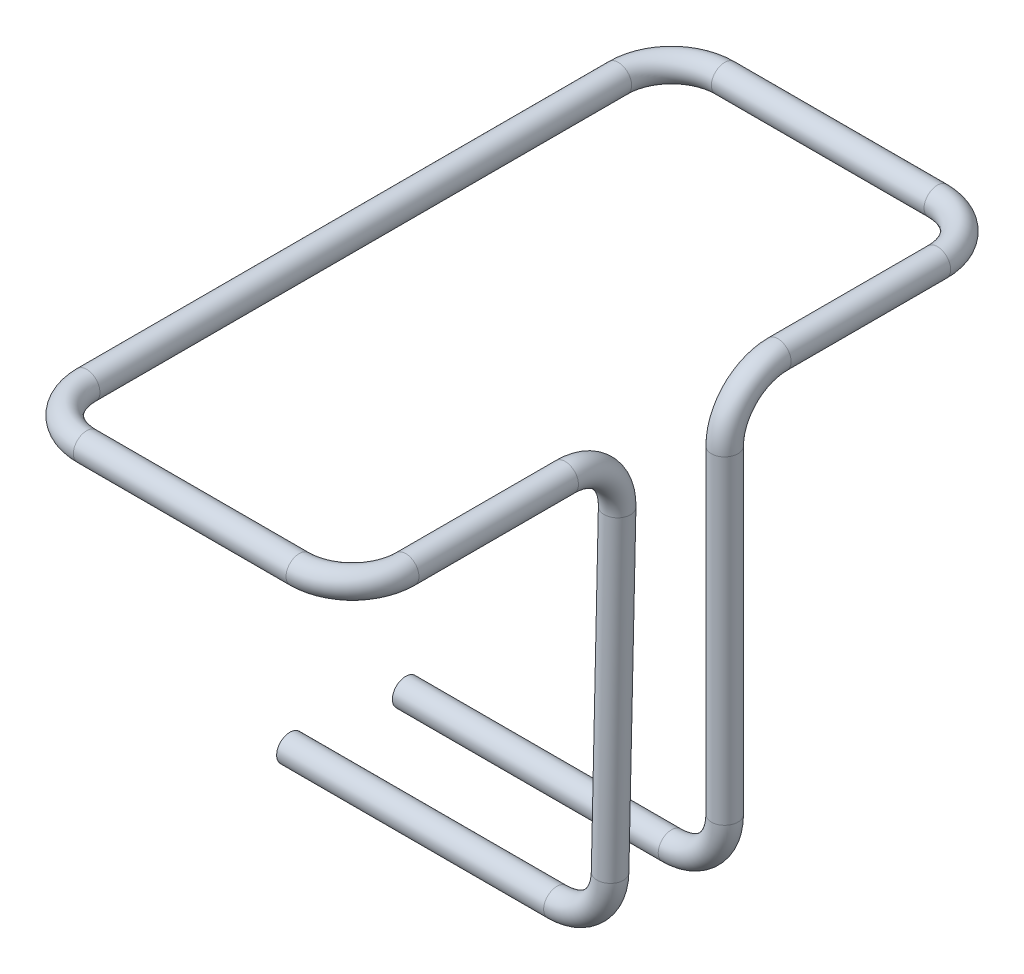
ISO-10303-21;
HEADER;
FILE_DESCRIPTION(('STEP AP214'),'2;1');
FILE_NAME('part.step','',(''),(''),'','','');
FILE_SCHEMA(('AUTOMOTIVE_DESIGN { 1 0 10303 214 1 1 1 1 }'));
ENDSEC;
DATA;
#1=APPLICATION_CONTEXT('core data for automotive mechanical design processes');
#2=APPLICATION_PROTOCOL_DEFINITION('international standard','automotive_design',2000,#1);
#3=PRODUCT_CONTEXT('',#1,'mechanical');
#4=PRODUCT('Part','Part','',(#3));
#5=PRODUCT_RELATED_PRODUCT_CATEGORY('part','',(#4));
#6=PRODUCT_DEFINITION_FORMATION('','',#4);
#7=PRODUCT_DEFINITION_CONTEXT('part definition',#1,'design');
#8=PRODUCT_DEFINITION('design','',#6,#7);
#9=PRODUCT_DEFINITION_SHAPE('','',#8);
#10=(LENGTH_UNIT() NAMED_UNIT(*) SI_UNIT(.MILLI.,.METRE.));
#11=(NAMED_UNIT(*) PLANE_ANGLE_UNIT() SI_UNIT($,.RADIAN.));
#12=(NAMED_UNIT(*) SI_UNIT($,.STERADIAN.) SOLID_ANGLE_UNIT());
#13=UNCERTAINTY_MEASURE_WITH_UNIT(LENGTH_MEASURE(1.E-05),#10,'distance_accuracy_value','');
#14=(GEOMETRIC_REPRESENTATION_CONTEXT(3) GLOBAL_UNCERTAINTY_ASSIGNED_CONTEXT((#13)) GLOBAL_UNIT_ASSIGNED_CONTEXT((#10,
#11,#12)) REPRESENTATION_CONTEXT('',''));
#15=CARTESIAN_POINT('',(0.,0.,0.));
#16=DIRECTION('',(0.,0.,1.));
#17=DIRECTION('',(1.,0.,0.));
#18=AXIS2_PLACEMENT_3D('',#15,#16,#17);
#19=CARTESIAN_POINT('',(0.,0.,0.));
#20=DIRECTION('',(1.,0.,0.));
#21=DIRECTION('',(0.,0.,-1.));
#22=AXIS2_PLACEMENT_3D('',#19,#20,#21);
#23=PLANE('',#22);
#24=CARTESIAN_POINT('',(0.,0.,0.));
#25=DIRECTION('',(1.,0.,0.));
#26=DIRECTION('',(0.,0.,-1.));
#27=AXIS2_PLACEMENT_3D('',#24,#25,#26);
#28=CIRCLE('',#27,0.125);
#29=CARTESIAN_POINT('',(0.,0.,-0.125));
#30=VERTEX_POINT('',#29);
#31=EDGE_CURVE('E89',#30,#30,#28,.T.);
#32=ORIENTED_EDGE('',*,*,#31,.F.);
#33=EDGE_LOOP('',(#32));
#34=FACE_BOUND('',#33,.T.);
#35=ADVANCED_FACE('F31',(#34),#23,.F.);
#36=CARTESIAN_POINT('',(0.0883487566823759,-0.000975806875798228,-1.));
#37=DIRECTION('',(-1.,0.,0.));
#38=DIRECTION('',(0.,-0.0220871891705938,0.999756048281051));
#39=AXIS2_PLACEMENT_3D('',#36,#37,#38);
#40=PLANE('',#39);
#41=CARTESIAN_POINT('',(0.0883487566823759,-0.000975806875798228,-1.));
#42=DIRECTION('',(-1.,0.,0.));
#43=DIRECTION('',(0.,-0.0220871891705938,0.999756048281051));
#44=AXIS2_PLACEMENT_3D('',#41,#42,#43);
#45=CIRCLE('',#44,0.125);
#46=CARTESIAN_POINT('',(0.0883487566823759,-0.00373670552212245,-0.875030493964869));
#47=VERTEX_POINT('',#46);
#48=EDGE_CURVE('E10',#47,#47,#45,.T.);
#49=ORIENTED_EDGE('',*,*,#48,.T.);
#50=EDGE_LOOP('',(#49));
#51=FACE_BOUND('',#50,.T.);
#52=ADVANCED_FACE('F96',(#51),#40,.T.);
#53=CARTESIAN_POINT('',(0.,0.,0.));
#54=DIRECTION('',(1.,0.,0.));
#55=DIRECTION('',(0.,0.,-1.));
#56=AXIS2_PLACEMENT_3D('',#53,#54,#55);
#57=CYLINDRICAL_SURFACE('',#56,0.125);
#58=CARTESIAN_POINT('',(2.51092428372362,0.,0.));
#59=DIRECTION('',(1.,0.,0.));
#60=DIRECTION('',(0.,0.,-1.));
#61=AXIS2_PLACEMENT_3D('',#58,#59,#60);
#62=CIRCLE('',#61,0.125);
#63=CARTESIAN_POINT('',(2.51092428372362,-0.125,0.));
#64=VERTEX_POINT('',#63);
#65=EDGE_CURVE('E86',#64,#64,#62,.T.);
#66=ORIENTED_EDGE('',*,*,#65,.F.);
#67=EDGE_LOOP('',(#66));
#68=FACE_BOUND('',#67,.T.);
#69=ORIENTED_EDGE('',*,*,#31,.T.);
#70=EDGE_LOOP('',(#69));
#71=FACE_BOUND('',#70,.T.);
#72=ADVANCED_FACE('F93',(#68,#71),#57,.T.);
#73=CARTESIAN_POINT('',(2.51092428372361,0.5,0.));
#74=DIRECTION('',(0.,0.,1.));
#75=DIRECTION('',(1.,0.,0.));
#76=AXIS2_PLACEMENT_3D('',#73,#74,#75);
#77=TOROIDAL_SURFACE('',#76,0.5,0.125);
#78=CARTESIAN_POINT('',(3.01080230786414,0.488956405414703,0.));
#79=DIRECTION('',(0.0220871891705935,0.999756048281051,0.));
#80=DIRECTION('',(0.,0.,-1.));
#81=AXIS2_PLACEMENT_3D('',#78,#79,#80);
#82=CIRCLE('',#81,0.125);
#83=CARTESIAN_POINT('',(3.13577181389927,0.486195506768379,0.));
#84=VERTEX_POINT('',#83);
#85=EDGE_CURVE('E83',#84,#84,#82,.T.);
#86=CARTESIAN_POINT('',(2.51092428372361,0.5,0.));
#87=DIRECTION('',(0.,0.,1.));
#88=DIRECTION('',(1.,0.,0.));
#89=AXIS2_PLACEMENT_3D('',#86,#87,#88);
#90=CIRCLE('',#89,0.625);
#91=EDGE_CURVE('',#64,#84,#90,.T.);
#92=ORIENTED_EDGE('',*,*,#65,.T.);
#93=ORIENTED_EDGE('',*,*,#85,.F.);
#94=ORIENTED_EDGE('',*,*,#91,.T.);
#95=ORIENTED_EDGE('',*,*,#91,.F.);
#96=EDGE_LOOP('',(#92,#94,#93,#95));
#97=FACE_BOUND('',#96,.T.);
#98=ADVANCED_FACE('F162',(#97),#77,.T.);
#99=CARTESIAN_POINT('',(3.01080230786414,0.488956405414703,0.));
#100=DIRECTION('',(0.022087189170594,0.999756048281051,0.));
#101=DIRECTION('',(-0.999756048281051,0.022087189170594,0.));
#102=AXIS2_PLACEMENT_3D('',#99,#100,#101);
#103=CYLINDRICAL_SURFACE('',#102,0.125);
#104=CARTESIAN_POINT('',(3.07730516209708,3.49914616898368,0.));
#105=DIRECTION('',(0.022087189170594,0.999756048281051,0.));
#106=DIRECTION('',(0.,0.,-1.));
#107=AXIS2_PLACEMENT_3D('',#104,#105,#106);
#108=CIRCLE('',#107,0.125);
#109=CARTESIAN_POINT('',(3.07730516209708,3.49914616898368,-0.125));
#110=VERTEX_POINT('',#109);
#111=EDGE_CURVE('E80',#110,#110,#108,.T.);
#112=ORIENTED_EDGE('',*,*,#111,.F.);
#113=EDGE_LOOP('',(#112));
#114=FACE_BOUND('',#113,.T.);
#115=ORIENTED_EDGE('',*,*,#85,.T.);
#116=EDGE_LOOP('',(#115));
#117=FACE_BOUND('',#116,.T.);
#118=ADVANCED_FACE('F158',(#114,#117),#103,.T.);
#119=CARTESIAN_POINT('',(3.07730516209708,3.49914616898368,0.5));
#120=DIRECTION('',(0.999756048281051,-0.0220871891705937,0.));
#121=DIRECTION('',(0.0220871891705937,0.999756048281051,0.));
#122=AXIS2_PLACEMENT_3D('',#119,#120,#121);
#123=TOROIDAL_SURFACE('',#122,0.5,0.125);
#124=CARTESIAN_POINT('',(3.08834875668238,3.9990241931242,0.5));
#125=DIRECTION('',(0.,0.,1.));
#126=DIRECTION('',(0.0220871891705937,0.999756048281051,0.));
#127=AXIS2_PLACEMENT_3D('',#124,#125,#126);
#128=CIRCLE('',#127,0.125);
#129=CARTESIAN_POINT('',(3.0911096553287,4.12399369915933,0.5));
#130=VERTEX_POINT('',#129);
#131=EDGE_CURVE('E77',#130,#130,#128,.T.);
#132=CARTESIAN_POINT('',(3.07730516209708,3.49914616898368,0.5));
#133=DIRECTION('',(0.999756048281051,-0.0220871891705937,0.));
#134=DIRECTION('',(0.0220871891705937,0.999756048281051,0.));
#135=AXIS2_PLACEMENT_3D('',#132,#133,#134);
#136=CIRCLE('',#135,0.625);
#137=EDGE_CURVE('',#110,#130,#136,.T.);
#138=ORIENTED_EDGE('',*,*,#111,.T.);
#139=ORIENTED_EDGE('',*,*,#131,.F.);
#140=ORIENTED_EDGE('',*,*,#137,.T.);
#141=ORIENTED_EDGE('',*,*,#137,.F.);
#142=EDGE_LOOP('',(#138,#140,#139,#141));
#143=FACE_BOUND('',#142,.T.);
#144=ADVANCED_FACE('F154',(#143),#123,.T.);
#145=CARTESIAN_POINT('',(3.08834875668238,3.9990241931242,0.5));
#146=DIRECTION('',(0.,0.,1.));
#147=DIRECTION('',(0.,-1.,0.));
#148=AXIS2_PLACEMENT_3D('',#145,#146,#147);
#149=CYLINDRICAL_SURFACE('',#148,0.125);
#150=CARTESIAN_POINT('',(3.08834875668238,3.9990241931242,2.));
#151=DIRECTION('',(0.,0.,1.));
#152=DIRECTION('',(0.0220871891705938,0.999756048281051,0.));
#153=AXIS2_PLACEMENT_3D('',#150,#151,#152);
#154=CIRCLE('',#153,0.125);
#155=CARTESIAN_POINT('',(3.21334875668238,3.9990241931242,2.));
#156=VERTEX_POINT('',#155);
#157=EDGE_CURVE('E74',#156,#156,#154,.T.);
#158=ORIENTED_EDGE('',*,*,#157,.F.);
#159=EDGE_LOOP('',(#158));
#160=FACE_BOUND('',#159,.T.);
#161=ORIENTED_EDGE('',*,*,#131,.T.);
#162=EDGE_LOOP('',(#161));
#163=FACE_BOUND('',#162,.T.);
#164=ADVANCED_FACE('F150',(#160,#163),#149,.T.);
#165=CARTESIAN_POINT('',(2.58834875668238,3.9990241931242,2.));
#166=DIRECTION('',(0.,-1.,0.));
#167=DIRECTION('',(0.,0.,-1.));
#168=AXIS2_PLACEMENT_3D('',#165,#166,#167);
#169=TOROIDAL_SURFACE('',#168,0.5,0.125);
#170=CARTESIAN_POINT('',(2.58834875668238,3.9990241931242,2.5));
#171=DIRECTION('',(-1.,0.,0.));
#172=DIRECTION('',(0.,0.999756048281051,0.0220871891705938));
#173=AXIS2_PLACEMENT_3D('',#170,#171,#172);
#174=CIRCLE('',#173,0.125);
#175=CARTESIAN_POINT('',(2.58834875668238,3.9990241931242,2.625));
#176=VERTEX_POINT('',#175);
#177=EDGE_CURVE('E71',#176,#176,#174,.T.);
#178=CARTESIAN_POINT('',(2.58834875668238,3.9990241931242,2.));
#179=DIRECTION('',(0.,-1.,0.));
#180=DIRECTION('',(0.,0.,-1.));
#181=AXIS2_PLACEMENT_3D('',#178,#179,#180);
#182=CIRCLE('',#181,0.625);
#183=EDGE_CURVE('',#156,#176,#182,.T.);
#184=ORIENTED_EDGE('',*,*,#157,.T.);
#185=ORIENTED_EDGE('',*,*,#177,.F.);
#186=ORIENTED_EDGE('',*,*,#183,.T.);
#187=ORIENTED_EDGE('',*,*,#183,.F.);
#188=EDGE_LOOP('',(#184,#186,#185,#187));
#189=FACE_BOUND('',#188,.T.);
#190=ADVANCED_FACE('F146',(#189),#169,.T.);
#191=CARTESIAN_POINT('',(2.58834875668238,3.9990241931242,2.5));
#192=DIRECTION('',(-1.,0.,0.));
#193=DIRECTION('',(0.,0.,1.));
#194=AXIS2_PLACEMENT_3D('',#191,#192,#193);
#195=CYLINDRICAL_SURFACE('',#194,0.125);
#196=CARTESIAN_POINT('',(0.588348756682376,3.9990241931242,2.5));
#197=DIRECTION('',(-1.,0.,0.));
#198=DIRECTION('',(0.,0.999756048281051,0.0220871891705938));
#199=AXIS2_PLACEMENT_3D('',#196,#197,#198);
#200=CIRCLE('',#199,0.125);
#201=CARTESIAN_POINT('',(0.588348756682376,3.9990241931242,2.625));
#202=VERTEX_POINT('',#201);
#203=EDGE_CURVE('E68',#202,#202,#200,.T.);
#204=ORIENTED_EDGE('',*,*,#203,.F.);
#205=EDGE_LOOP('',(#204));
#206=FACE_BOUND('',#205,.T.);
#207=ORIENTED_EDGE('',*,*,#177,.T.);
#208=EDGE_LOOP('',(#207));
#209=FACE_BOUND('',#208,.T.);
#210=ADVANCED_FACE('F142',(#206,#209),#195,.T.);
#211=CARTESIAN_POINT('',(0.588348756682376,3.9990241931242,2.));
#212=DIRECTION('',(0.,-1.,0.));
#213=DIRECTION('',(0.,0.,-1.));
#214=AXIS2_PLACEMENT_3D('',#211,#212,#213);
#215=TOROIDAL_SURFACE('',#214,0.5,0.125);
#216=CARTESIAN_POINT('',(0.0883487566823759,3.9990241931242,2.));
#217=DIRECTION('',(0.,0.,-1.));
#218=DIRECTION('',(-0.0220871891705938,0.999756048281051,0.));
#219=AXIS2_PLACEMENT_3D('',#216,#217,#218);
#220=CIRCLE('',#219,0.125);
#221=CARTESIAN_POINT('',(-0.0366512433176241,3.9990241931242,2.));
#222=VERTEX_POINT('',#221);
#223=EDGE_CURVE('E65',#222,#222,#220,.T.);
#224=CARTESIAN_POINT('',(0.588348756682376,3.9990241931242,2.));
#225=DIRECTION('',(0.,-1.,0.));
#226=DIRECTION('',(0.,0.,-1.));
#227=AXIS2_PLACEMENT_3D('',#224,#225,#226);
#228=CIRCLE('',#227,0.625);
#229=EDGE_CURVE('',#202,#222,#228,.T.);
#230=ORIENTED_EDGE('',*,*,#203,.T.);
#231=ORIENTED_EDGE('',*,*,#223,.F.);
#232=ORIENTED_EDGE('',*,*,#229,.T.);
#233=ORIENTED_EDGE('',*,*,#229,.F.);
#234=EDGE_LOOP('',(#230,#232,#231,#233));
#235=FACE_BOUND('',#234,.T.);
#236=ADVANCED_FACE('F138',(#235),#215,.T.);
#237=CARTESIAN_POINT('',(0.0883487566823759,3.9990241931242,2.));
#238=DIRECTION('',(0.,0.,-1.));
#239=DIRECTION('',(-1.,0.,0.));
#240=AXIS2_PLACEMENT_3D('',#237,#238,#239);
#241=CYLINDRICAL_SURFACE('',#240,0.125);
#242=CARTESIAN_POINT('',(0.0883487566823759,3.9990241931242,-3.));
#243=DIRECTION('',(0.,0.,-1.));
#244=DIRECTION('',(-0.0220871891705938,0.999756048281051,0.));
#245=AXIS2_PLACEMENT_3D('',#242,#243,#244);
#246=CIRCLE('',#245,0.125);
#247=CARTESIAN_POINT('',(-0.0366512433176241,3.9990241931242,-3.));
#248=VERTEX_POINT('',#247);
#249=EDGE_CURVE('E62',#248,#248,#246,.T.);
#250=ORIENTED_EDGE('',*,*,#249,.F.);
#251=EDGE_LOOP('',(#250));
#252=FACE_BOUND('',#251,.T.);
#253=ORIENTED_EDGE('',*,*,#223,.T.);
#254=EDGE_LOOP('',(#253));
#255=FACE_BOUND('',#254,.T.);
#256=ADVANCED_FACE('F134',(#252,#255),#241,.T.);
#257=CARTESIAN_POINT('',(0.588348756682376,3.9990241931242,-3.));
#258=DIRECTION('',(0.,-1.,0.));
#259=DIRECTION('',(0.,0.,-1.));
#260=AXIS2_PLACEMENT_3D('',#257,#258,#259);
#261=TOROIDAL_SURFACE('',#260,0.5,0.125);
#262=CARTESIAN_POINT('',(0.588348756682376,3.9990241931242,-3.5));
#263=DIRECTION('',(1.,0.,0.));
#264=DIRECTION('',(0.,0.999756048281051,-0.0220871891705938));
#265=AXIS2_PLACEMENT_3D('',#262,#263,#264);
#266=CIRCLE('',#265,0.125);
#267=CARTESIAN_POINT('',(0.588348756682376,3.9990241931242,-3.625));
#268=VERTEX_POINT('',#267);
#269=EDGE_CURVE('E59',#268,#268,#266,.T.);
#270=CARTESIAN_POINT('',(0.588348756682376,3.9990241931242,-3.));
#271=DIRECTION('',(0.,-1.,0.));
#272=DIRECTION('',(0.,0.,-1.));
#273=AXIS2_PLACEMENT_3D('',#270,#271,#272);
#274=CIRCLE('',#273,0.625);
#275=EDGE_CURVE('',#248,#268,#274,.T.);
#276=ORIENTED_EDGE('',*,*,#249,.T.);
#277=ORIENTED_EDGE('',*,*,#269,.F.);
#278=ORIENTED_EDGE('',*,*,#275,.T.);
#279=ORIENTED_EDGE('',*,*,#275,.F.);
#280=EDGE_LOOP('',(#276,#278,#277,#279));
#281=FACE_BOUND('',#280,.T.);
#282=ADVANCED_FACE('F130',(#281),#261,.T.);
#283=CARTESIAN_POINT('',(0.588348756682376,3.9990241931242,-3.5));
#284=DIRECTION('',(1.,0.,0.));
#285=DIRECTION('',(0.,0.,-1.));
#286=AXIS2_PLACEMENT_3D('',#283,#284,#285);
#287=CYLINDRICAL_SURFACE('',#286,0.125);
#288=CARTESIAN_POINT('',(2.58834875668238,3.9990241931242,-3.5));
#289=DIRECTION('',(1.,0.,0.));
#290=DIRECTION('',(0.,0.999756048281051,-0.0220871891705938));
#291=AXIS2_PLACEMENT_3D('',#288,#289,#290);
#292=CIRCLE('',#291,0.125);
#293=CARTESIAN_POINT('',(2.58834875668238,3.9990241931242,-3.625));
#294=VERTEX_POINT('',#293);
#295=EDGE_CURVE('E56',#294,#294,#292,.T.);
#296=ORIENTED_EDGE('',*,*,#295,.F.);
#297=EDGE_LOOP('',(#296));
#298=FACE_BOUND('',#297,.T.);
#299=ORIENTED_EDGE('',*,*,#269,.T.);
#300=EDGE_LOOP('',(#299));
#301=FACE_BOUND('',#300,.T.);
#302=ADVANCED_FACE('F126',(#298,#301),#287,.T.);
#303=CARTESIAN_POINT('',(2.58834875668238,3.9990241931242,-3.));
#304=DIRECTION('',(0.,-1.,0.));
#305=DIRECTION('',(0.,0.,-1.));
#306=AXIS2_PLACEMENT_3D('',#303,#304,#305);
#307=TOROIDAL_SURFACE('',#306,0.5,0.125);
#308=CARTESIAN_POINT('',(3.08834875668238,3.9990241931242,-3.));
#309=DIRECTION('',(0.,0.,1.));
#310=DIRECTION('',(0.0220871891705938,0.999756048281051,0.));
#311=AXIS2_PLACEMENT_3D('',#308,#309,#310);
#312=CIRCLE('',#311,0.125);
#313=CARTESIAN_POINT('',(3.21334875668238,3.9990241931242,-3.));
#314=VERTEX_POINT('',#313);
#315=EDGE_CURVE('E53',#314,#314,#312,.T.);
#316=CARTESIAN_POINT('',(2.58834875668238,3.9990241931242,-3.));
#317=DIRECTION('',(0.,-1.,0.));
#318=DIRECTION('',(0.,0.,-1.));
#319=AXIS2_PLACEMENT_3D('',#316,#317,#318);
#320=CIRCLE('',#319,0.625);
#321=EDGE_CURVE('',#294,#314,#320,.T.);
#322=ORIENTED_EDGE('',*,*,#295,.T.);
#323=ORIENTED_EDGE('',*,*,#315,.F.);
#324=ORIENTED_EDGE('',*,*,#321,.T.);
#325=ORIENTED_EDGE('',*,*,#321,.F.);
#326=EDGE_LOOP('',(#322,#324,#323,#325));
#327=FACE_BOUND('',#326,.T.);
#328=ADVANCED_FACE('F122',(#327),#307,.T.);
#329=CARTESIAN_POINT('',(3.08834875668238,3.9990241931242,-3.));
#330=DIRECTION('',(0.,0.,1.));
#331=DIRECTION('',(1.,0.,0.));
#332=AXIS2_PLACEMENT_3D('',#329,#330,#331);
#333=CYLINDRICAL_SURFACE('',#332,0.125);
#334=CARTESIAN_POINT('',(3.08834875668238,3.9990241931242,-1.5));
#335=DIRECTION('',(0.,0.,1.));
#336=DIRECTION('',(0.0220871891705938,0.999756048281051,0.));
#337=AXIS2_PLACEMENT_3D('',#334,#335,#336);
#338=CIRCLE('',#337,0.125);
#339=CARTESIAN_POINT('',(3.08834875668238,4.1240241931242,-1.5));
#340=VERTEX_POINT('',#339);
#341=EDGE_CURVE('E50',#340,#340,#338,.T.);
#342=ORIENTED_EDGE('',*,*,#341,.F.);
#343=EDGE_LOOP('',(#342));
#344=FACE_BOUND('',#343,.T.);
#345=ORIENTED_EDGE('',*,*,#315,.T.);
#346=EDGE_LOOP('',(#345));
#347=FACE_BOUND('',#346,.T.);
#348=ADVANCED_FACE('F118',(#344,#347),#333,.T.);
#349=CARTESIAN_POINT('',(3.08834875668238,3.4990241931242,-1.5));
#350=DIRECTION('',(1.,0.,0.));
#351=DIRECTION('',(0.,0.,-1.));
#352=AXIS2_PLACEMENT_3D('',#349,#350,#351);
#353=TOROIDAL_SURFACE('',#352,0.5,0.125);
#354=CARTESIAN_POINT('',(3.08834875668238,3.4990241931242,-1.));
#355=DIRECTION('',(0.,-1.,0.));
#356=DIRECTION('',(0.0220871891705938,0.,0.999756048281051));
#357=AXIS2_PLACEMENT_3D('',#354,#355,#356);
#358=CIRCLE('',#357,0.125);
#359=CARTESIAN_POINT('',(3.08834875668238,3.4990241931242,-0.875));
#360=VERTEX_POINT('',#359);
#361=EDGE_CURVE('E45',#360,#360,#358,.T.);
#362=CARTESIAN_POINT('',(3.08834875668238,3.4990241931242,-1.5));
#363=DIRECTION('',(1.,0.,0.));
#364=DIRECTION('',(0.,0.,-1.));
#365=AXIS2_PLACEMENT_3D('',#362,#363,#364);
#366=CIRCLE('',#365,0.625);
#367=EDGE_CURVE('',#340,#360,#366,.T.);
#368=ORIENTED_EDGE('',*,*,#341,.T.);
#369=ORIENTED_EDGE('',*,*,#361,.F.);
#370=ORIENTED_EDGE('',*,*,#367,.T.);
#371=ORIENTED_EDGE('',*,*,#367,.F.);
#372=EDGE_LOOP('',(#368,#370,#369,#371));
#373=FACE_BOUND('',#372,.T.);
#374=ADVANCED_FACE('F114',(#373),#353,.T.);
#375=CARTESIAN_POINT('',(3.08834875668238,3.4990241931242,-1.));
#376=DIRECTION('',(0.,-1.,0.));
#377=DIRECTION('',(0.,0.,-1.));
#378=AXIS2_PLACEMENT_3D('',#375,#376,#377);
#379=CYLINDRICAL_SURFACE('',#378,0.125);
#380=CARTESIAN_POINT('',(3.08834875668238,0.499024193124202,-1.));
#381=DIRECTION('',(0.,-1.,0.));
#382=DIRECTION('',(0.0220871891705938,0.,0.999756048281051));
#383=AXIS2_PLACEMENT_3D('',#380,#381,#382);
#384=CIRCLE('',#383,0.125);
#385=CARTESIAN_POINT('',(3.21334875668238,0.499024193124202,-1.));
#386=VERTEX_POINT('',#385);
#387=EDGE_CURVE('E41',#386,#386,#384,.T.);
#388=ORIENTED_EDGE('',*,*,#387,.F.);
#389=EDGE_LOOP('',(#388));
#390=FACE_BOUND('',#389,.T.);
#391=ORIENTED_EDGE('',*,*,#361,.T.);
#392=EDGE_LOOP('',(#391));
#393=FACE_BOUND('',#392,.T.);
#394=ADVANCED_FACE('F108',(#390,#393),#379,.T.);
#395=CARTESIAN_POINT('',(2.58834875668238,0.499024193124202,-1.));
#396=DIRECTION('',(0.,0.,-1.));
#397=DIRECTION('',(-1.,0.,0.));
#398=AXIS2_PLACEMENT_3D('',#395,#396,#397);
#399=TOROIDAL_SURFACE('',#398,0.5,0.125);
#400=CARTESIAN_POINT('',(2.58834875668238,-0.000975806875798228,-1.));
#401=DIRECTION('',(-1.,0.,0.));
#402=DIRECTION('',(0.,-0.0220871891705938,0.999756048281051));
#403=AXIS2_PLACEMENT_3D('',#400,#401,#402);
#404=CIRCLE('',#403,0.125);
#405=CARTESIAN_POINT('',(2.58834875668238,-0.125975806875798,-1.));
#406=VERTEX_POINT('',#405);
#407=EDGE_CURVE('E37',#406,#406,#404,.T.);
#408=CARTESIAN_POINT('',(2.58834875668238,0.499024193124202,-1.));
#409=DIRECTION('',(0.,0.,-1.));
#410=DIRECTION('',(-1.,0.,0.));
#411=AXIS2_PLACEMENT_3D('',#408,#409,#410);
#412=CIRCLE('',#411,0.625);
#413=EDGE_CURVE('',#386,#406,#412,.T.);
#414=ORIENTED_EDGE('',*,*,#387,.T.);
#415=ORIENTED_EDGE('',*,*,#407,.F.);
#416=ORIENTED_EDGE('',*,*,#413,.T.);
#417=ORIENTED_EDGE('',*,*,#413,.F.);
#418=EDGE_LOOP('',(#414,#416,#415,#417));
#419=FACE_BOUND('',#418,.T.);
#420=ADVANCED_FACE('F102',(#419),#399,.T.);
#421=CARTESIAN_POINT('',(2.58834875668238,-0.000975806875798228,-1.));
#422=DIRECTION('',(-1.,0.,0.));
#423=DIRECTION('',(0.,0.,1.));
#424=AXIS2_PLACEMENT_3D('',#421,#422,#423);
#425=CYLINDRICAL_SURFACE('',#424,0.125);
#426=ORIENTED_EDGE('',*,*,#48,.F.);
#427=EDGE_LOOP('',(#426));
#428=FACE_BOUND('',#427,.T.);
#429=ORIENTED_EDGE('',*,*,#407,.T.);
#430=EDGE_LOOP('',(#429));
#431=FACE_BOUND('',#430,.T.);
#432=ADVANCED_FACE('F100',(#428,#431),#425,.T.);
#433=CLOSED_SHELL('',(#35,#52,#72,#98,#118,#144,#164,#190,#210,#236,#256,#282,#302,#328,#348,
#374,#394,#420,#432));
#434=MANIFOLD_SOLID_BREP('B2',#433);
#435=ADVANCED_BREP_SHAPE_REPRESENTATION('',(#18,#434),#14);
#436=SHAPE_DEFINITION_REPRESENTATION(#9,#435);
ENDSEC;
END-ISO-10303-21;
